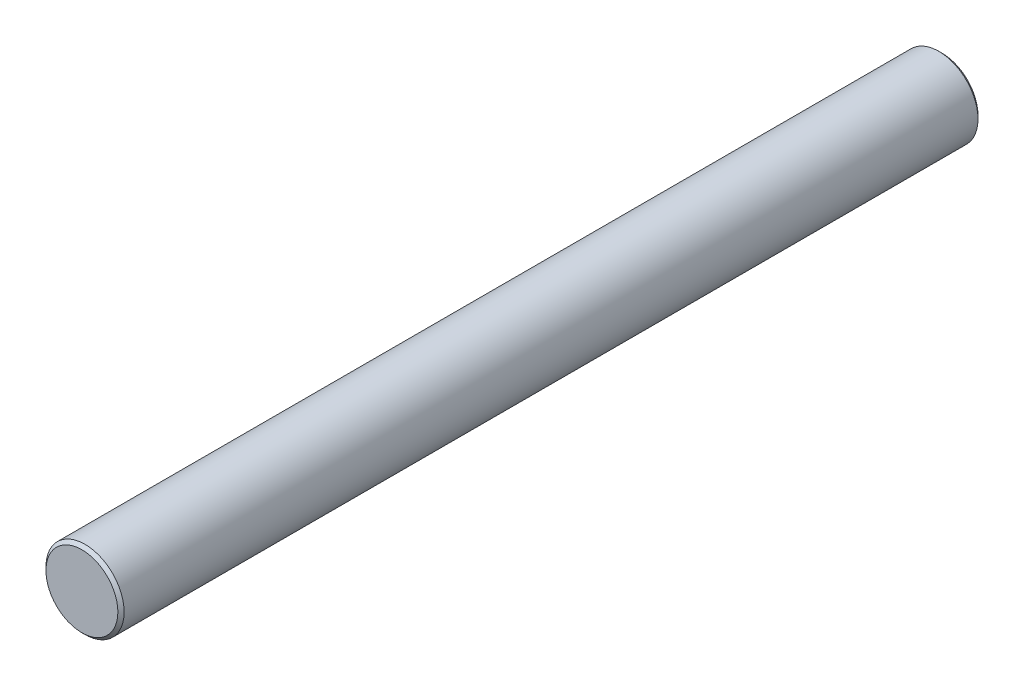
ISO-10303-21;
HEADER;
FILE_DESCRIPTION(('STEP AP214'),'2;1');
FILE_NAME('part.step','',(''),(''),'','','');
FILE_SCHEMA(('AUTOMOTIVE_DESIGN { 1 0 10303 214 1 1 1 1 }'));
ENDSEC;
DATA;
#1=APPLICATION_CONTEXT('core data for automotive mechanical design processes');
#2=APPLICATION_PROTOCOL_DEFINITION('international standard','automotive_design',2000,#1);
#3=PRODUCT_CONTEXT('',#1,'mechanical');
#4=PRODUCT('Part','Part','',(#3));
#5=PRODUCT_RELATED_PRODUCT_CATEGORY('part','',(#4));
#6=PRODUCT_DEFINITION_FORMATION('','',#4);
#7=PRODUCT_DEFINITION_CONTEXT('part definition',#1,'design');
#8=PRODUCT_DEFINITION('design','',#6,#7);
#9=PRODUCT_DEFINITION_SHAPE('','',#8);
#10=(LENGTH_UNIT() NAMED_UNIT(*) SI_UNIT(.MILLI.,.METRE.));
#11=(NAMED_UNIT(*) PLANE_ANGLE_UNIT() SI_UNIT($,.RADIAN.));
#12=(NAMED_UNIT(*) SI_UNIT($,.STERADIAN.) SOLID_ANGLE_UNIT());
#13=UNCERTAINTY_MEASURE_WITH_UNIT(LENGTH_MEASURE(1.E-05),#10,'distance_accuracy_value','');
#14=(GEOMETRIC_REPRESENTATION_CONTEXT(3) GLOBAL_UNCERTAINTY_ASSIGNED_CONTEXT((#13)) GLOBAL_UNIT_ASSIGNED_CONTEXT((#10,
#11,#12)) REPRESENTATION_CONTEXT('',''));
#15=CARTESIAN_POINT('',(0.,0.,0.));
#16=DIRECTION('',(0.,0.,1.));
#17=DIRECTION('',(1.,0.,0.));
#18=AXIS2_PLACEMENT_3D('',#15,#16,#17);
#19=CARTESIAN_POINT('',(0.,0.,33.));
#20=DIRECTION('',(0.,0.,-1.));
#21=DIRECTION('',(-1.,0.,0.));
#22=AXIS2_PLACEMENT_3D('',#19,#20,#21);
#23=CYLINDRICAL_SURFACE('',#22,1.5);
#24=CARTESIAN_POINT('',(0.,0.,0.119999999999999));
#25=DIRECTION('',(0.,0.,1.));
#26=DIRECTION('',(1.,0.,0.));
#27=AXIS2_PLACEMENT_3D('',#24,#25,#26);
#28=CIRCLE('',#27,1.5);
#29=CARTESIAN_POINT('',(1.5,0.,0.119999999999999));
#30=VERTEX_POINT('',#29);
#31=EDGE_CURVE('E56',#30,#30,#28,.T.);
#32=ORIENTED_EDGE('',*,*,#31,.T.);
#33=EDGE_LOOP('',(#32));
#34=FACE_BOUND('',#33,.T.);
#35=CARTESIAN_POINT('',(0.,0.,32.88));
#36=DIRECTION('',(0.,0.,1.));
#37=DIRECTION('',(1.,0.,0.));
#38=AXIS2_PLACEMENT_3D('',#35,#36,#37);
#39=CIRCLE('',#38,1.5);
#40=CARTESIAN_POINT('',(1.5,0.,32.88));
#41=VERTEX_POINT('',#40);
#42=EDGE_CURVE('E60',#41,#41,#39,.F.);
#43=ORIENTED_EDGE('',*,*,#42,.T.);
#44=EDGE_LOOP('',(#43));
#45=FACE_BOUND('',#44,.T.);
#46=ADVANCED_FACE('F45',(#34,#45),#23,.T.);
#47=CARTESIAN_POINT('',(0.,0.,33.));
#48=DIRECTION('',(0.,0.,1.));
#49=DIRECTION('',(1.,0.,0.));
#50=AXIS2_PLACEMENT_3D('',#47,#48,#49);
#51=PLANE('',#50);
#52=CARTESIAN_POINT('',(0.,0.,33.));
#53=DIRECTION('',(0.,0.,1.));
#54=DIRECTION('',(1.,0.,0.));
#55=AXIS2_PLACEMENT_3D('',#52,#53,#54);
#56=CIRCLE('',#55,1.38);
#57=CARTESIAN_POINT('',(1.38,0.,33.));
#58=VERTEX_POINT('',#57);
#59=EDGE_CURVE('E10',#58,#58,#56,.T.);
#60=ORIENTED_EDGE('',*,*,#59,.T.);
#61=EDGE_LOOP('',(#60));
#62=FACE_BOUND('',#61,.T.);
#63=ADVANCED_FACE('F76',(#62),#51,.T.);
#64=CARTESIAN_POINT('',(0.,0.,0.));
#65=DIRECTION('',(0.,0.,1.));
#66=DIRECTION('',(1.,0.,0.));
#67=AXIS2_PLACEMENT_3D('',#64,#65,#66);
#68=PLANE('',#67);
#69=CARTESIAN_POINT('',(0.,0.,0.));
#70=DIRECTION('',(0.,0.,1.));
#71=DIRECTION('',(1.,0.,0.));
#72=AXIS2_PLACEMENT_3D('',#69,#70,#71);
#73=CIRCLE('',#72,1.38);
#74=CARTESIAN_POINT('',(1.38,0.,0.));
#75=VERTEX_POINT('',#74);
#76=EDGE_CURVE('E52',#75,#75,#73,.F.);
#77=ORIENTED_EDGE('',*,*,#76,.T.);
#78=EDGE_LOOP('',(#77));
#79=FACE_BOUND('',#78,.T.);
#80=ADVANCED_FACE('F73',(#79),#68,.F.);
#81=CARTESIAN_POINT('',(0.,0.,0.119999999999999));
#82=DIRECTION('',(0.,0.,1.));
#83=DIRECTION('',(1.,0.,0.));
#84=AXIS2_PLACEMENT_3D('',#81,#82,#83);
#85=CONICAL_SURFACE('',#84,1.5,0.785398163397443);
#86=ORIENTED_EDGE('',*,*,#76,.F.);
#87=EDGE_LOOP('',(#86));
#88=FACE_BOUND('',#87,.T.);
#89=ORIENTED_EDGE('',*,*,#31,.F.);
#90=EDGE_LOOP('',(#89));
#91=FACE_BOUND('',#90,.T.);
#92=ADVANCED_FACE('F69',(#88,#91),#85,.T.);
#93=CARTESIAN_POINT('',(0.,0.,33.));
#94=DIRECTION('',(0.,0.,-1.));
#95=DIRECTION('',(-1.,0.,0.));
#96=AXIS2_PLACEMENT_3D('',#93,#94,#95);
#97=CONICAL_SURFACE('',#96,1.38,0.785398163397426);
#98=ORIENTED_EDGE('',*,*,#42,.F.);
#99=EDGE_LOOP('',(#98));
#100=FACE_BOUND('',#99,.T.);
#101=ORIENTED_EDGE('',*,*,#59,.F.);
#102=EDGE_LOOP('',(#101));
#103=FACE_BOUND('',#102,.T.);
#104=ADVANCED_FACE('F47',(#100,#103),#97,.T.);
#105=CLOSED_SHELL('',(#46,#63,#80,#92,#104));
#106=MANIFOLD_SOLID_BREP('B2',#105);
#107=ADVANCED_BREP_SHAPE_REPRESENTATION('',(#18,#106),#14);
#108=SHAPE_DEFINITION_REPRESENTATION(#9,#107);
ENDSEC;
END-ISO-10303-21;
